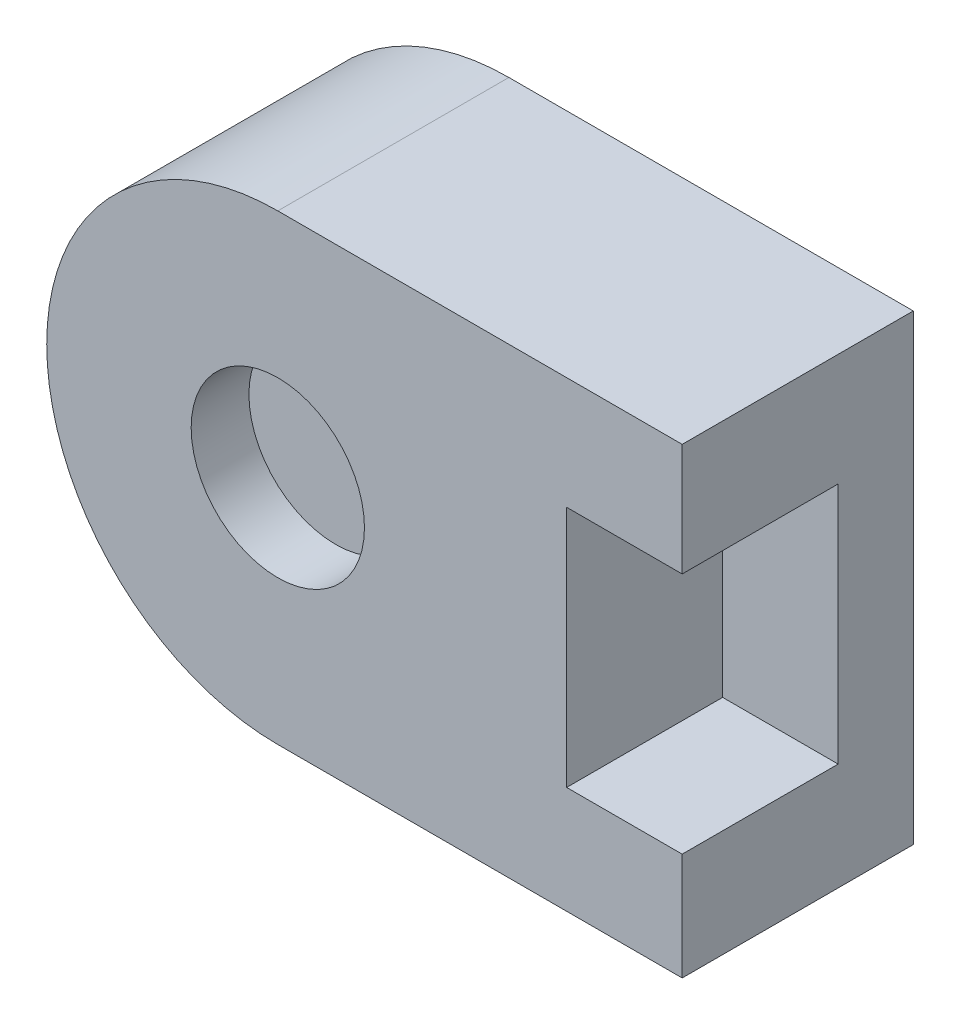
ISO-10303-21;
HEADER;
FILE_DESCRIPTION(('STEP AP214'),'2;1');
FILE_NAME('part.step','',(''),(''),'','','');
FILE_SCHEMA(('AUTOMOTIVE_DESIGN { 1 0 10303 214 1 1 1 1 }'));
ENDSEC;
DATA;
#1=APPLICATION_CONTEXT('core data for automotive mechanical design processes');
#2=APPLICATION_PROTOCOL_DEFINITION('international standard','automotive_design',2000,#1);
#3=PRODUCT_CONTEXT('',#1,'mechanical');
#4=PRODUCT('Part','Part','',(#3));
#5=PRODUCT_RELATED_PRODUCT_CATEGORY('part','',(#4));
#6=PRODUCT_DEFINITION_FORMATION('','',#4);
#7=PRODUCT_DEFINITION_CONTEXT('part definition',#1,'design');
#8=PRODUCT_DEFINITION('design','',#6,#7);
#9=PRODUCT_DEFINITION_SHAPE('','',#8);
#10=(LENGTH_UNIT() NAMED_UNIT(*) SI_UNIT(.MILLI.,.METRE.));
#11=(NAMED_UNIT(*) PLANE_ANGLE_UNIT() SI_UNIT($,.RADIAN.));
#12=(NAMED_UNIT(*) SI_UNIT($,.STERADIAN.) SOLID_ANGLE_UNIT());
#13=UNCERTAINTY_MEASURE_WITH_UNIT(LENGTH_MEASURE(1.E-05),#10,'distance_accuracy_value','');
#14=(GEOMETRIC_REPRESENTATION_CONTEXT(3) GLOBAL_UNCERTAINTY_ASSIGNED_CONTEXT((#13)) GLOBAL_UNIT_ASSIGNED_CONTEXT((#10,
#11,#12)) REPRESENTATION_CONTEXT('',''));
#15=CARTESIAN_POINT('',(0.,0.,0.));
#16=DIRECTION('',(0.,0.,1.));
#17=DIRECTION('',(1.,0.,0.));
#18=AXIS2_PLACEMENT_3D('',#15,#16,#17);
#19=CARTESIAN_POINT('',(0.,0.,40.));
#20=DIRECTION('',(0.,0.,-1.));
#21=DIRECTION('',(-1.,0.,0.));
#22=AXIS2_PLACEMENT_3D('',#19,#20,#21);
#23=CYLINDRICAL_SURFACE('',#22,40.);
#24=CARTESIAN_POINT('',(0.,0.,0.));
#25=DIRECTION('',(0.,0.,1.));
#26=DIRECTION('',(1.,0.,0.));
#27=AXIS2_PLACEMENT_3D('',#24,#25,#26);
#28=CIRCLE('',#27,40.);
#29=CARTESIAN_POINT('',(0.,40.,0.));
#30=VERTEX_POINT('',#29);
#31=CARTESIAN_POINT('',(0.,-40.,0.));
#32=VERTEX_POINT('',#31);
#33=EDGE_CURVE('E141',#30,#32,#28,.T.);
#34=ORIENTED_EDGE('',*,*,#33,.T.);
#35=DIRECTION('',(0.,0.,-1.));
#36=VECTOR('',#35,1.);
#37=CARTESIAN_POINT('',(0.,-40.,40.));
#38=LINE('',#37,#36);
#39=CARTESIAN_POINT('',(0.,-40.,40.));
#40=VERTEX_POINT('',#39);
#41=EDGE_CURVE('E11',#40,#32,#38,.T.);
#42=ORIENTED_EDGE('',*,*,#41,.F.);
#43=CARTESIAN_POINT('',(0.,0.,40.));
#44=DIRECTION('',(0.,0.,1.));
#45=DIRECTION('',(1.,0.,0.));
#46=AXIS2_PLACEMENT_3D('',#43,#44,#45);
#47=CIRCLE('',#46,40.);
#48=CARTESIAN_POINT('',(0.,40.,40.));
#49=VERTEX_POINT('',#48);
#50=EDGE_CURVE('E145',#49,#40,#47,.T.);
#51=ORIENTED_EDGE('',*,*,#50,.F.);
#52=DIRECTION('',(0.,0.,-1.));
#53=VECTOR('',#52,1.);
#54=CARTESIAN_POINT('',(0.,40.,40.));
#55=LINE('',#54,#53);
#56=EDGE_CURVE('E153',#49,#30,#55,.T.);
#57=ORIENTED_EDGE('',*,*,#56,.T.);
#58=EDGE_LOOP('',(#34,#42,#51,#57));
#59=FACE_BOUND('',#58,.T.);
#60=ADVANCED_FACE('F33',(#59),#23,.T.);
#61=CARTESIAN_POINT('',(70.,-40.,40.));
#62=DIRECTION('',(0.,1.,0.));
#63=DIRECTION('',(0.,0.,1.));
#64=AXIS2_PLACEMENT_3D('',#61,#62,#63);
#65=PLANE('',#64);
#66=DIRECTION('',(1.,0.,0.));
#67=VECTOR('',#66,1.);
#68=CARTESIAN_POINT('',(70.,-40.,0.));
#69=LINE('',#68,#67);
#70=CARTESIAN_POINT('',(70.,-40.,0.));
#71=VERTEX_POINT('',#70);
#72=EDGE_CURVE('E156',#32,#71,#69,.T.);
#73=ORIENTED_EDGE('',*,*,#72,.T.);
#74=DIRECTION('',(0.,0.,-1.));
#75=VECTOR('',#74,1.);
#76=CARTESIAN_POINT('',(70.,-40.,40.));
#77=LINE('',#76,#75);
#78=CARTESIAN_POINT('',(70.,-40.,40.));
#79=VERTEX_POINT('',#78);
#80=EDGE_CURVE('E40',#79,#71,#77,.T.);
#81=ORIENTED_EDGE('',*,*,#80,.F.);
#82=DIRECTION('',(1.,0.,0.));
#83=VECTOR('',#82,1.);
#84=CARTESIAN_POINT('',(70.,-40.,40.));
#85=LINE('',#84,#83);
#86=EDGE_CURVE('E84',#40,#79,#85,.T.);
#87=ORIENTED_EDGE('',*,*,#86,.F.);
#88=ORIENTED_EDGE('',*,*,#41,.T.);
#89=EDGE_LOOP('',(#73,#81,#87,#88));
#90=FACE_BOUND('',#89,.T.);
#91=ADVANCED_FACE('F192',(#90),#65,.F.);
#92=CARTESIAN_POINT('',(70.,40.,40.));
#93=DIRECTION('',(-1.,0.,0.));
#94=DIRECTION('',(0.,0.,1.));
#95=AXIS2_PLACEMENT_3D('',#92,#93,#94);
#96=PLANE('',#95);
#97=DIRECTION('',(0.,1.,0.));
#98=VECTOR('',#97,1.);
#99=CARTESIAN_POINT('',(70.,40.,40.));
#100=LINE('',#99,#98);
#101=CARTESIAN_POINT('',(70.,20.5670380257908,40.));
#102=VERTEX_POINT('',#101);
#103=CARTESIAN_POINT('',(70.,40.,40.));
#104=VERTEX_POINT('',#103);
#105=EDGE_CURVE('E148',#102,#104,#100,.T.);
#106=ORIENTED_EDGE('',*,*,#105,.F.);
#107=DIRECTION('',(0.,0.,1.));
#108=VECTOR('',#107,1.);
#109=CARTESIAN_POINT('',(70.,20.5670380257908,13.));
#110=LINE('',#109,#108);
#111=CARTESIAN_POINT('',(70.,20.5670380257908,13.));
#112=VERTEX_POINT('',#111);
#113=EDGE_CURVE('E142',#112,#102,#110,.T.);
#114=ORIENTED_EDGE('',*,*,#113,.F.);
#115=DIRECTION('',(0.,1.,0.));
#116=VECTOR('',#115,1.);
#117=CARTESIAN_POINT('',(70.,20.5670380257908,13.));
#118=LINE('',#117,#116);
#119=CARTESIAN_POINT('',(70.,-21.4329619742092,13.));
#120=VERTEX_POINT('',#119);
#121=EDGE_CURVE('E121',#120,#112,#118,.T.);
#122=ORIENTED_EDGE('',*,*,#121,.F.);
#123=DIRECTION('',(0.,0.,1.));
#124=VECTOR('',#123,1.);
#125=CARTESIAN_POINT('',(70.,-21.4329619742092,13.));
#126=LINE('',#125,#124);
#127=CARTESIAN_POINT('',(70.,-21.4329619742092,40.));
#128=VERTEX_POINT('',#127);
#129=EDGE_CURVE('E112',#120,#128,#126,.T.);
#130=ORIENTED_EDGE('',*,*,#129,.T.);
#131=EDGE_CURVE('E149',#79,#128,#100,.T.);
#132=ORIENTED_EDGE('',*,*,#131,.F.);
#133=ORIENTED_EDGE('',*,*,#80,.T.);
#134=DIRECTION('',(0.,1.,0.));
#135=VECTOR('',#134,1.);
#136=CARTESIAN_POINT('',(70.,40.,0.));
#137=LINE('',#136,#135);
#138=CARTESIAN_POINT('',(70.,40.,0.));
#139=VERTEX_POINT('',#138);
#140=EDGE_CURVE('E158',#71,#139,#137,.T.);
#141=ORIENTED_EDGE('',*,*,#140,.T.);
#142=DIRECTION('',(0.,0.,-1.));
#143=VECTOR('',#142,1.);
#144=CARTESIAN_POINT('',(70.,40.,40.));
#145=LINE('',#144,#143);
#146=EDGE_CURVE('E162',#104,#139,#145,.T.);
#147=ORIENTED_EDGE('',*,*,#146,.F.);
#148=EDGE_LOOP('',(#106,#114,#122,#130,#132,#133,#141,#147));
#149=FACE_BOUND('',#148,.T.);
#150=ADVANCED_FACE('F168',(#149),#96,.F.);
#151=CARTESIAN_POINT('',(0.,40.,40.));
#152=DIRECTION('',(0.,-1.,0.));
#153=DIRECTION('',(0.,0.,-1.));
#154=AXIS2_PLACEMENT_3D('',#151,#152,#153);
#155=PLANE('',#154);
#156=DIRECTION('',(-1.,0.,0.));
#157=VECTOR('',#156,1.);
#158=CARTESIAN_POINT('',(0.,40.,0.));
#159=LINE('',#158,#157);
#160=EDGE_CURVE('E77',#139,#30,#159,.T.);
#161=ORIENTED_EDGE('',*,*,#160,.T.);
#162=ORIENTED_EDGE('',*,*,#56,.F.);
#163=DIRECTION('',(-1.,0.,0.));
#164=VECTOR('',#163,1.);
#165=CARTESIAN_POINT('',(0.,40.,40.));
#166=LINE('',#165,#164);
#167=EDGE_CURVE('E56',#104,#49,#166,.T.);
#168=ORIENTED_EDGE('',*,*,#167,.F.);
#169=ORIENTED_EDGE('',*,*,#146,.T.);
#170=EDGE_LOOP('',(#161,#162,#168,#169));
#171=FACE_BOUND('',#170,.T.);
#172=ADVANCED_FACE('F176',(#171),#155,.F.);
#173=CARTESIAN_POINT('',(0.,0.,40.));
#174=DIRECTION('',(0.,0.,1.));
#175=DIRECTION('',(1.,0.,0.));
#176=AXIS2_PLACEMENT_3D('',#173,#174,#175);
#177=PLANE('',#176);
#178=CARTESIAN_POINT('',(0.,0.,40.));
#179=DIRECTION('',(0.,0.,1.));
#180=DIRECTION('',(1.,0.,0.));
#181=AXIS2_PLACEMENT_3D('',#178,#179,#180);
#182=CIRCLE('',#181,15.);
#183=CARTESIAN_POINT('',(15.,0.,40.));
#184=VERTEX_POINT('',#183);
#185=EDGE_CURVE('E131',#184,#184,#182,.T.);
#186=ORIENTED_EDGE('',*,*,#185,.F.);
#187=EDGE_LOOP('',(#186));
#188=FACE_BOUND('',#187,.T.);
#189=DIRECTION('',(-1.,0.,0.));
#190=VECTOR('',#189,1.);
#191=CARTESIAN_POINT('',(50.,20.5670380257908,40.));
#192=LINE('',#191,#190);
#193=CARTESIAN_POINT('',(50.,20.5670380257908,40.));
#194=VERTEX_POINT('',#193);
#195=EDGE_CURVE('E125',#102,#194,#192,.T.);
#196=ORIENTED_EDGE('',*,*,#195,.F.);
#197=ORIENTED_EDGE('',*,*,#105,.T.);
#198=ORIENTED_EDGE('',*,*,#167,.T.);
#199=ORIENTED_EDGE('',*,*,#50,.T.);
#200=ORIENTED_EDGE('',*,*,#86,.T.);
#201=ORIENTED_EDGE('',*,*,#131,.T.);
#202=DIRECTION('',(1.,0.,0.));
#203=VECTOR('',#202,1.);
#204=CARTESIAN_POINT('',(50.,-21.4329619742092,40.));
#205=LINE('',#204,#203);
#206=CARTESIAN_POINT('',(50.,-21.4329619742092,40.));
#207=VERTEX_POINT('',#206);
#208=EDGE_CURVE('E128',#207,#128,#205,.T.);
#209=ORIENTED_EDGE('',*,*,#208,.F.);
#210=DIRECTION('',(0.,-1.,0.));
#211=VECTOR('',#210,1.);
#212=CARTESIAN_POINT('',(50.,20.5670380257908,40.));
#213=LINE('',#212,#211);
#214=EDGE_CURVE('E47',#194,#207,#213,.T.);
#215=ORIENTED_EDGE('',*,*,#214,.F.);
#216=EDGE_LOOP('',(#196,#197,#198,#199,#200,#201,#209,#215));
#217=FACE_BOUND('',#216,.T.);
#218=ADVANCED_FACE('F179',(#188,#217),#177,.T.);
#219=CARTESIAN_POINT('',(0.,0.,0.));
#220=DIRECTION('',(0.,0.,1.));
#221=DIRECTION('',(1.,0.,0.));
#222=AXIS2_PLACEMENT_3D('',#219,#220,#221);
#223=PLANE('',#222);
#224=ORIENTED_EDGE('',*,*,#33,.F.);
#225=ORIENTED_EDGE('',*,*,#160,.F.);
#226=ORIENTED_EDGE('',*,*,#140,.F.);
#227=ORIENTED_EDGE('',*,*,#72,.F.);
#228=EDGE_LOOP('',(#224,#225,#226,#227));
#229=FACE_BOUND('',#228,.T.);
#230=ADVANCED_FACE('F172',(#229),#223,.F.);
#231=CARTESIAN_POINT('',(50.,20.5670380257908,13.));
#232=DIRECTION('',(-1.,0.,0.));
#233=DIRECTION('',(0.,-1.,0.));
#234=AXIS2_PLACEMENT_3D('',#231,#232,#233);
#235=PLANE('',#234);
#236=ORIENTED_EDGE('',*,*,#214,.T.);
#237=DIRECTION('',(0.,0.,1.));
#238=VECTOR('',#237,1.);
#239=CARTESIAN_POINT('',(50.,-21.4329619742092,13.));
#240=LINE('',#239,#238);
#241=CARTESIAN_POINT('',(50.,-21.4329619742092,13.));
#242=VERTEX_POINT('',#241);
#243=EDGE_CURVE('E104',#242,#207,#240,.T.);
#244=ORIENTED_EDGE('',*,*,#243,.F.);
#245=DIRECTION('',(0.,-1.,0.));
#246=VECTOR('',#245,1.);
#247=CARTESIAN_POINT('',(50.,20.5670380257908,13.));
#248=LINE('',#247,#246);
#249=CARTESIAN_POINT('',(50.,20.5670380257908,13.));
#250=VERTEX_POINT('',#249);
#251=EDGE_CURVE('E108',#250,#242,#248,.T.);
#252=ORIENTED_EDGE('',*,*,#251,.F.);
#253=DIRECTION('',(0.,0.,1.));
#254=VECTOR('',#253,1.);
#255=CARTESIAN_POINT('',(50.,20.5670380257908,13.));
#256=LINE('',#255,#254);
#257=EDGE_CURVE('E139',#250,#194,#256,.T.);
#258=ORIENTED_EDGE('',*,*,#257,.T.);
#259=EDGE_LOOP('',(#236,#244,#252,#258));
#260=FACE_BOUND('',#259,.T.);
#261=ADVANCED_FACE('F106',(#260),#235,.F.);
#262=CARTESIAN_POINT('',(50.,20.5670380257908,13.));
#263=DIRECTION('',(0.,1.,0.));
#264=DIRECTION('',(0.,0.,1.));
#265=AXIS2_PLACEMENT_3D('',#262,#263,#264);
#266=PLANE('',#265);
#267=ORIENTED_EDGE('',*,*,#195,.T.);
#268=ORIENTED_EDGE('',*,*,#257,.F.);
#269=DIRECTION('',(-1.,0.,0.));
#270=VECTOR('',#269,1.);
#271=CARTESIAN_POINT('',(50.,20.5670380257908,13.));
#272=LINE('',#271,#270);
#273=EDGE_CURVE('E113',#112,#250,#272,.T.);
#274=ORIENTED_EDGE('',*,*,#273,.F.);
#275=ORIENTED_EDGE('',*,*,#113,.T.);
#276=EDGE_LOOP('',(#267,#268,#274,#275));
#277=FACE_BOUND('',#276,.T.);
#278=ADVANCED_FACE('F181',(#277),#266,.F.);
#279=CARTESIAN_POINT('',(50.,-21.4329619742092,13.));
#280=DIRECTION('',(0.,-1.,0.));
#281=DIRECTION('',(0.,0.,-1.));
#282=AXIS2_PLACEMENT_3D('',#279,#280,#281);
#283=PLANE('',#282);
#284=ORIENTED_EDGE('',*,*,#208,.T.);
#285=ORIENTED_EDGE('',*,*,#129,.F.);
#286=DIRECTION('',(1.,0.,0.));
#287=VECTOR('',#286,1.);
#288=CARTESIAN_POINT('',(50.,-21.4329619742092,13.));
#289=LINE('',#288,#287);
#290=EDGE_CURVE('E116',#242,#120,#289,.T.);
#291=ORIENTED_EDGE('',*,*,#290,.F.);
#292=ORIENTED_EDGE('',*,*,#243,.T.);
#293=EDGE_LOOP('',(#284,#285,#291,#292));
#294=FACE_BOUND('',#293,.T.);
#295=ADVANCED_FACE('F117',(#294),#283,.F.);
#296=CARTESIAN_POINT('',(0.,0.,13.));
#297=DIRECTION('',(0.,0.,1.));
#298=DIRECTION('',(1.,0.,0.));
#299=AXIS2_PLACEMENT_3D('',#296,#297,#298);
#300=PLANE('',#299);
#301=ORIENTED_EDGE('',*,*,#251,.T.);
#302=ORIENTED_EDGE('',*,*,#290,.T.);
#303=ORIENTED_EDGE('',*,*,#121,.T.);
#304=ORIENTED_EDGE('',*,*,#273,.T.);
#305=EDGE_LOOP('',(#301,#302,#303,#304));
#306=FACE_BOUND('',#305,.T.);
#307=ADVANCED_FACE('F123',(#306),#300,.T.);
#308=CARTESIAN_POINT('',(0.,0.,30.));
#309=DIRECTION('',(0.,0.,1.));
#310=DIRECTION('',(1.,0.,0.));
#311=AXIS2_PLACEMENT_3D('',#308,#309,#310);
#312=CYLINDRICAL_SURFACE('',#311,15.);
#313=CARTESIAN_POINT('',(0.,0.,30.));
#314=DIRECTION('',(0.,0.,1.));
#315=DIRECTION('',(1.,0.,0.));
#316=AXIS2_PLACEMENT_3D('',#313,#314,#315);
#317=CIRCLE('',#316,15.);
#318=CARTESIAN_POINT('',(15.,0.,30.));
#319=VERTEX_POINT('',#318);
#320=EDGE_CURVE('E137',#319,#319,#317,.T.);
#321=ORIENTED_EDGE('',*,*,#320,.F.);
#322=EDGE_LOOP('',(#321));
#323=FACE_BOUND('',#322,.T.);
#324=ORIENTED_EDGE('',*,*,#185,.T.);
#325=EDGE_LOOP('',(#324));
#326=FACE_BOUND('',#325,.T.);
#327=ADVANCED_FACE('F217',(#323,#326),#312,.F.);
#328=CARTESIAN_POINT('',(0.,0.,30.));
#329=DIRECTION('',(0.,0.,1.));
#330=DIRECTION('',(1.,0.,0.));
#331=AXIS2_PLACEMENT_3D('',#328,#329,#330);
#332=PLANE('',#331);
#333=ORIENTED_EDGE('',*,*,#320,.T.);
#334=EDGE_LOOP('',(#333));
#335=FACE_BOUND('',#334,.T.);
#336=ADVANCED_FACE('F215',(#335),#332,.T.);
#337=CLOSED_SHELL('',(#60,#91,#150,#172,#218,#230,#261,#278,#295,#307,#327,#336));
#338=MANIFOLD_SOLID_BREP('B2',#337);
#339=ADVANCED_BREP_SHAPE_REPRESENTATION('',(#18,#338),#14);
#340=SHAPE_DEFINITION_REPRESENTATION(#9,#339);
ENDSEC;
END-ISO-10303-21;
